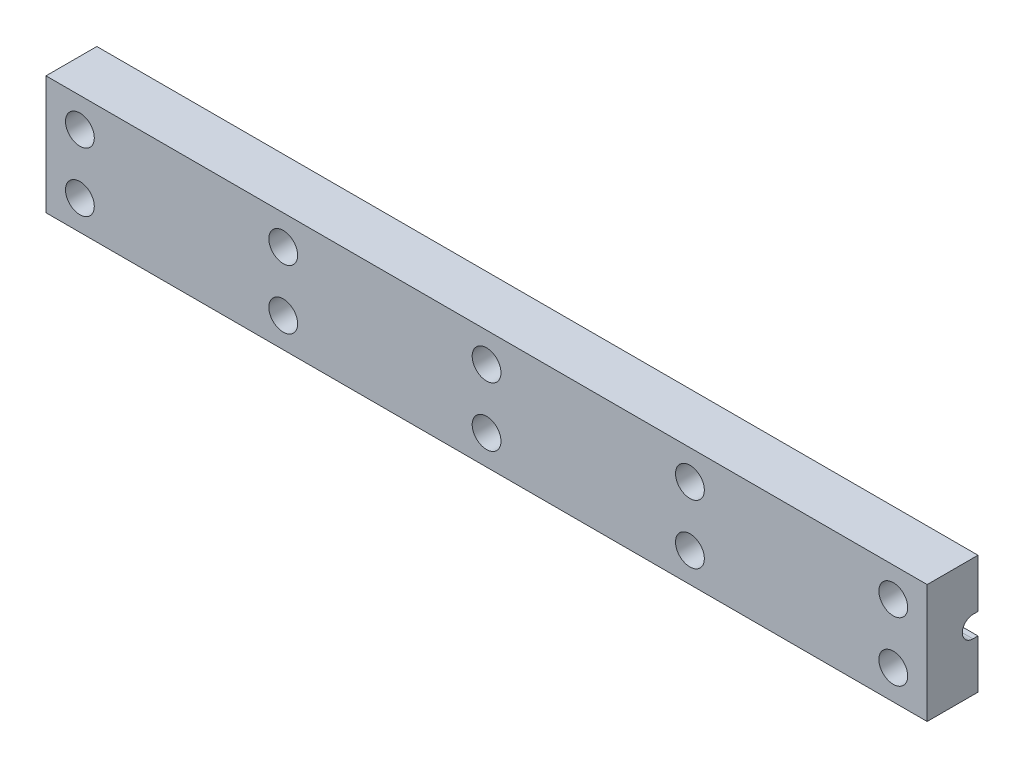
ISO-10303-21;
HEADER;
FILE_DESCRIPTION(('STEP AP214'),'2;1');
FILE_NAME('part.step','',(''),(''),'','','');
FILE_SCHEMA(('AUTOMOTIVE_DESIGN { 1 0 10303 214 1 1 1 1 }'));
ENDSEC;
DATA;
#1=APPLICATION_CONTEXT('core data for automotive mechanical design processes');
#2=APPLICATION_PROTOCOL_DEFINITION('international standard','automotive_design',2000,#1);
#3=PRODUCT_CONTEXT('',#1,'mechanical');
#4=PRODUCT('Part','Part','',(#3));
#5=PRODUCT_RELATED_PRODUCT_CATEGORY('part','',(#4));
#6=PRODUCT_DEFINITION_FORMATION('','',#4);
#7=PRODUCT_DEFINITION_CONTEXT('part definition',#1,'design');
#8=PRODUCT_DEFINITION('design','',#6,#7);
#9=PRODUCT_DEFINITION_SHAPE('','',#8);
#10=(LENGTH_UNIT() NAMED_UNIT(*) SI_UNIT(.MILLI.,.METRE.));
#11=(NAMED_UNIT(*) PLANE_ANGLE_UNIT() SI_UNIT($,.RADIAN.));
#12=(NAMED_UNIT(*) SI_UNIT($,.STERADIAN.) SOLID_ANGLE_UNIT());
#13=UNCERTAINTY_MEASURE_WITH_UNIT(LENGTH_MEASURE(1.E-05),#10,'distance_accuracy_value','');
#14=(GEOMETRIC_REPRESENTATION_CONTEXT(3) GLOBAL_UNCERTAINTY_ASSIGNED_CONTEXT((#13)) GLOBAL_UNIT_ASSIGNED_CONTEXT((#10,
#11,#12)) REPRESENTATION_CONTEXT('',''));
#15=CARTESIAN_POINT('',(0.,0.,0.));
#16=DIRECTION('',(0.,0.,1.));
#17=DIRECTION('',(1.,0.,0.));
#18=AXIS2_PLACEMENT_3D('',#15,#16,#17);
#19=CARTESIAN_POINT('',(170.645147999783,197.163538158501,246.970904960978));
#20=DIRECTION('',(0.,0.,1.));
#21=DIRECTION('',(1.,0.,0.));
#22=AXIS2_PLACEMENT_3D('',#19,#20,#21);
#23=PLANE('',#22);
#24=CARTESIAN_POINT('',(150.645147999783,204.663538158501,246.970904960979));
#25=DIRECTION('',(0.,0.,1.));
#26=DIRECTION('',(1.,0.,0.));
#27=AXIS2_PLACEMENT_3D('',#24,#25,#26);
#28=CIRCLE('',#27,1.70000000000001);
#29=CARTESIAN_POINT('',(152.345147999783,204.663538158501,246.970904960979));
#30=VERTEX_POINT('',#29);
#31=EDGE_CURVE('E127',#30,#30,#28,.T.);
#32=ORIENTED_EDGE('',*,*,#31,.F.);
#33=EDGE_LOOP('',(#32));
#34=FACE_BOUND('',#33,.T.);
#35=CARTESIAN_POINT('',(150.645147999783,197.6635381585,246.970904960979));
#36=DIRECTION('',(0.,0.,1.));
#37=DIRECTION('',(1.,0.,0.));
#38=AXIS2_PLACEMENT_3D('',#35,#36,#37);
#39=CIRCLE('',#38,1.70000000000001);
#40=CARTESIAN_POINT('',(152.345147999783,197.6635381585,246.970904960979));
#41=VERTEX_POINT('',#40);
#42=EDGE_CURVE('E219',#41,#41,#39,.T.);
#43=ORIENTED_EDGE('',*,*,#42,.F.);
#44=EDGE_LOOP('',(#43));
#45=FACE_BOUND('',#44,.T.);
#46=CARTESIAN_POINT('',(198.645147999783,204.663538158501,246.970904960979));
#47=DIRECTION('',(0.,0.,1.));
#48=DIRECTION('',(1.,0.,0.));
#49=AXIS2_PLACEMENT_3D('',#46,#47,#48);
#50=CIRCLE('',#49,1.70000000000001);
#51=CARTESIAN_POINT('',(200.345147999783,204.663538158501,246.970904960979));
#52=VERTEX_POINT('',#51);
#53=EDGE_CURVE('E156',#52,#52,#50,.F.);
#54=ORIENTED_EDGE('',*,*,#53,.T.);
#55=EDGE_LOOP('',(#54));
#56=FACE_BOUND('',#55,.T.);
#57=CARTESIAN_POINT('',(246.645147999783,204.663538158501,246.970904960979));
#58=DIRECTION('',(0.,0.,1.));
#59=DIRECTION('',(1.,0.,0.));
#60=AXIS2_PLACEMENT_3D('',#57,#58,#59);
#61=CIRCLE('',#60,1.70000000000001);
#62=CARTESIAN_POINT('',(248.345147999783,204.663538158501,246.970904960979));
#63=VERTEX_POINT('',#62);
#64=EDGE_CURVE('E146',#63,#63,#61,.F.);
#65=ORIENTED_EDGE('',*,*,#64,.T.);
#66=EDGE_LOOP('',(#65));
#67=FACE_BOUND('',#66,.T.);
#68=CARTESIAN_POINT('',(222.645147999783,197.663538158501,246.970904960979));
#69=DIRECTION('',(0.,0.,1.));
#70=DIRECTION('',(1.,0.,0.));
#71=AXIS2_PLACEMENT_3D('',#68,#69,#70);
#72=CIRCLE('',#71,1.70000000000001);
#73=CARTESIAN_POINT('',(224.345147999783,197.663538158501,246.970904960979));
#74=VERTEX_POINT('',#73);
#75=EDGE_CURVE('E147',#74,#74,#72,.T.);
#76=ORIENTED_EDGE('',*,*,#75,.F.);
#77=EDGE_LOOP('',(#76));
#78=FACE_BOUND('',#77,.T.);
#79=CARTESIAN_POINT('',(174.645147999783,197.6635381585,246.970904960979));
#80=DIRECTION('',(0.,0.,1.));
#81=DIRECTION('',(1.,0.,0.));
#82=AXIS2_PLACEMENT_3D('',#79,#80,#81);
#83=CIRCLE('',#82,1.70000000000001);
#84=CARTESIAN_POINT('',(176.345147999783,197.6635381585,246.970904960979));
#85=VERTEX_POINT('',#84);
#86=EDGE_CURVE('E162',#85,#85,#83,.T.);
#87=ORIENTED_EDGE('',*,*,#86,.F.);
#88=EDGE_LOOP('',(#87));
#89=FACE_BOUND('',#88,.T.);
#90=DIRECTION('',(1.,0.,0.));
#91=VECTOR('',#90,1.);
#92=CARTESIAN_POINT('',(170.645147999783,194.163538158501,246.970904960978));
#93=LINE('',#92,#91);
#94=CARTESIAN_POINT('',(146.645147999783,194.163538158501,246.970904960978));
#95=VERTEX_POINT('',#94);
#96=CARTESIAN_POINT('',(250.645147999783,194.163538158501,246.970904960978));
#97=VERTEX_POINT('',#96);
#98=EDGE_CURVE('E109',#95,#97,#93,.T.);
#99=ORIENTED_EDGE('',*,*,#98,.T.);
#100=DIRECTION('',(0.,-1.,0.));
#101=VECTOR('',#100,1.);
#102=CARTESIAN_POINT('',(250.645147999783,208.163538158501,246.970904960978));
#103=LINE('',#102,#101);
#104=CARTESIAN_POINT('',(250.645147999783,208.163538158501,246.970904960978));
#105=VERTEX_POINT('',#104);
#106=EDGE_CURVE('E105',#105,#97,#103,.T.);
#107=ORIENTED_EDGE('',*,*,#106,.F.);
#108=DIRECTION('',(1.,0.,0.));
#109=VECTOR('',#108,1.);
#110=CARTESIAN_POINT('',(170.645147999783,208.163538158501,246.970904960978));
#111=LINE('',#110,#109);
#112=CARTESIAN_POINT('',(146.645147999783,208.163538158501,246.970904960978));
#113=VERTEX_POINT('',#112);
#114=EDGE_CURVE('E99',#113,#105,#111,.T.);
#115=ORIENTED_EDGE('',*,*,#114,.F.);
#116=DIRECTION('',(0.,1.,0.));
#117=VECTOR('',#116,1.);
#118=CARTESIAN_POINT('',(146.645147999783,194.163538158501,246.970904960978));
#119=LINE('',#118,#117);
#120=EDGE_CURVE('E103',#95,#113,#119,.T.);
#121=ORIENTED_EDGE('',*,*,#120,.F.);
#122=EDGE_LOOP('',(#99,#107,#115,#121));
#123=FACE_BOUND('',#122,.T.);
#124=CARTESIAN_POINT('',(246.645147999783,197.663538158501,246.970904960979));
#125=DIRECTION('',(0.,0.,1.));
#126=DIRECTION('',(1.,0.,0.));
#127=AXIS2_PLACEMENT_3D('',#124,#125,#126);
#128=CIRCLE('',#127,1.70000000000001);
#129=CARTESIAN_POINT('',(248.345147999783,197.663538158501,246.970904960979));
#130=VERTEX_POINT('',#129);
#131=EDGE_CURVE('E143',#130,#130,#128,.T.);
#132=ORIENTED_EDGE('',*,*,#131,.F.);
#133=EDGE_LOOP('',(#132));
#134=FACE_BOUND('',#133,.T.);
#135=CARTESIAN_POINT('',(174.645147999783,204.663538158501,246.970904960979));
#136=DIRECTION('',(0.,0.,1.));
#137=DIRECTION('',(1.,0.,0.));
#138=AXIS2_PLACEMENT_3D('',#135,#136,#137);
#139=CIRCLE('',#138,1.70000000000001);
#140=CARTESIAN_POINT('',(176.345147999783,204.663538158501,246.970904960979));
#141=VERTEX_POINT('',#140);
#142=EDGE_CURVE('E159',#141,#141,#139,.F.);
#143=ORIENTED_EDGE('',*,*,#142,.T.);
#144=EDGE_LOOP('',(#143));
#145=FACE_BOUND('',#144,.T.);
#146=CARTESIAN_POINT('',(198.645147999783,197.663538158501,246.970904960979));
#147=DIRECTION('',(0.,0.,1.));
#148=DIRECTION('',(1.,0.,0.));
#149=AXIS2_PLACEMENT_3D('',#146,#147,#148);
#150=CIRCLE('',#149,1.70000000000001);
#151=CARTESIAN_POINT('',(200.345147999783,197.663538158501,246.970904960979));
#152=VERTEX_POINT('',#151);
#153=EDGE_CURVE('E153',#152,#152,#150,.T.);
#154=ORIENTED_EDGE('',*,*,#153,.F.);
#155=EDGE_LOOP('',(#154));
#156=FACE_BOUND('',#155,.T.);
#157=CARTESIAN_POINT('',(222.645147999783,204.663538158501,246.970904960979));
#158=DIRECTION('',(0.,0.,1.));
#159=DIRECTION('',(1.,0.,0.));
#160=AXIS2_PLACEMENT_3D('',#157,#158,#159);
#161=CIRCLE('',#160,1.70000000000001);
#162=CARTESIAN_POINT('',(224.345147999783,204.663538158501,246.970904960979));
#163=VERTEX_POINT('',#162);
#164=EDGE_CURVE('E150',#163,#163,#161,.F.);
#165=ORIENTED_EDGE('',*,*,#164,.T.);
#166=EDGE_LOOP('',(#165));
#167=FACE_BOUND('',#166,.T.);
#168=ADVANCED_FACE('F33',(#34,#45,#56,#67,#78,#89,#123,#134,#145,#156,#167),#23,.T.);
#169=CARTESIAN_POINT('',(170.645147999783,208.163538158501,240.970904960978));
#170=DIRECTION('',(0.,1.,0.));
#171=DIRECTION('',(0.,0.,1.));
#172=AXIS2_PLACEMENT_3D('',#169,#170,#171);
#173=PLANE('',#172);
#174=ORIENTED_EDGE('',*,*,#114,.T.);
#175=DIRECTION('',(0.,0.,1.));
#176=VECTOR('',#175,1.);
#177=CARTESIAN_POINT('',(250.645147999783,208.163538158501,240.970904960978));
#178=LINE('',#177,#176);
#179=CARTESIAN_POINT('',(250.645147999783,208.163538158501,240.970904960978));
#180=VERTEX_POINT('',#179);
#181=EDGE_CURVE('E191',#180,#105,#178,.T.);
#182=ORIENTED_EDGE('',*,*,#181,.F.);
#183=DIRECTION('',(1.,0.,0.));
#184=VECTOR('',#183,1.);
#185=CARTESIAN_POINT('',(170.645147999783,208.163538158501,240.970904960978));
#186=LINE('',#185,#184);
#187=CARTESIAN_POINT('',(146.645147999783,208.163538158501,240.970904960978));
#188=VERTEX_POINT('',#187);
#189=EDGE_CURVE('E11',#188,#180,#186,.T.);
#190=ORIENTED_EDGE('',*,*,#189,.F.);
#191=DIRECTION('',(0.,0.,-1.));
#192=VECTOR('',#191,1.);
#193=CARTESIAN_POINT('',(146.645147999783,208.163538158501,246.970904960978));
#194=LINE('',#193,#192);
#195=EDGE_CURVE('E113',#113,#188,#194,.T.);
#196=ORIENTED_EDGE('',*,*,#195,.F.);
#197=EDGE_LOOP('',(#174,#182,#190,#196));
#198=FACE_BOUND('',#197,.T.);
#199=ADVANCED_FACE('F35',(#198),#173,.T.);
#200=CARTESIAN_POINT('',(170.645147999783,205.163538158501,240.970904960978));
#201=DIRECTION('',(0.,0.,-1.));
#202=DIRECTION('',(-1.,0.,0.));
#203=AXIS2_PLACEMENT_3D('',#200,#201,#202);
#204=PLANE('',#203);
#205=CARTESIAN_POINT('',(150.645147999783,204.663538158501,240.970904960978));
#206=DIRECTION('',(0.,0.,-1.));
#207=DIRECTION('',(-1.,0.,0.));
#208=AXIS2_PLACEMENT_3D('',#205,#206,#207);
#209=CIRCLE('',#208,1.70000000000001);
#210=CARTESIAN_POINT('',(148.945147999783,204.663538158501,240.970904960978));
#211=VERTEX_POINT('',#210);
#212=EDGE_CURVE('E37',#211,#211,#209,.T.);
#213=ORIENTED_EDGE('',*,*,#212,.F.);
#214=EDGE_LOOP('',(#213));
#215=FACE_BOUND('',#214,.T.);
#216=CARTESIAN_POINT('',(222.645147999783,204.663538158501,240.970904960978));
#217=DIRECTION('',(0.,0.,-1.));
#218=DIRECTION('',(-1.,0.,0.));
#219=AXIS2_PLACEMENT_3D('',#216,#217,#218);
#220=CIRCLE('',#219,1.70000000000001);
#221=CARTESIAN_POINT('',(220.945147999783,204.663538158501,240.970904960978));
#222=VERTEX_POINT('',#221);
#223=EDGE_CURVE('E188',#222,#222,#220,.F.);
#224=ORIENTED_EDGE('',*,*,#223,.T.);
#225=EDGE_LOOP('',(#224));
#226=FACE_BOUND('',#225,.T.);
#227=CARTESIAN_POINT('',(198.645147999783,204.663538158501,240.970904960978));
#228=DIRECTION('',(0.,0.,-1.));
#229=DIRECTION('',(-1.,0.,0.));
#230=AXIS2_PLACEMENT_3D('',#227,#228,#229);
#231=CIRCLE('',#230,1.70000000000001);
#232=CARTESIAN_POINT('',(196.945147999783,204.663538158501,240.970904960978));
#233=VERTEX_POINT('',#232);
#234=EDGE_CURVE('E182',#233,#233,#231,.F.);
#235=ORIENTED_EDGE('',*,*,#234,.T.);
#236=EDGE_LOOP('',(#235));
#237=FACE_BOUND('',#236,.T.);
#238=CARTESIAN_POINT('',(174.645147999783,204.663538158501,240.970904960978));
#239=DIRECTION('',(0.,0.,-1.));
#240=DIRECTION('',(-1.,0.,0.));
#241=AXIS2_PLACEMENT_3D('',#238,#239,#240);
#242=CIRCLE('',#241,1.70000000000001);
#243=CARTESIAN_POINT('',(172.945147999783,204.663538158501,240.970904960978));
#244=VERTEX_POINT('',#243);
#245=EDGE_CURVE('E179',#244,#244,#242,.F.);
#246=ORIENTED_EDGE('',*,*,#245,.T.);
#247=EDGE_LOOP('',(#246));
#248=FACE_BOUND('',#247,.T.);
#249=CARTESIAN_POINT('',(246.645147999783,204.663538158501,240.970904960978));
#250=DIRECTION('',(0.,0.,-1.));
#251=DIRECTION('',(-1.,0.,0.));
#252=AXIS2_PLACEMENT_3D('',#249,#250,#251);
#253=CIRCLE('',#252,1.70000000000001);
#254=CARTESIAN_POINT('',(244.945147999783,204.663538158501,240.970904960978));
#255=VERTEX_POINT('',#254);
#256=EDGE_CURVE('E173',#255,#255,#253,.F.);
#257=ORIENTED_EDGE('',*,*,#256,.T.);
#258=EDGE_LOOP('',(#257));
#259=FACE_BOUND('',#258,.T.);
#260=ORIENTED_EDGE('',*,*,#189,.T.);
#261=DIRECTION('',(0.,1.,0.));
#262=VECTOR('',#261,1.);
#263=CARTESIAN_POINT('',(250.645147999783,202.413538158492,240.970904960978));
#264=LINE('',#263,#262);
#265=CARTESIAN_POINT('',(250.645147999783,202.413538158492,240.970904960978));
#266=VERTEX_POINT('',#265);
#267=EDGE_CURVE('E110',#266,#180,#264,.T.);
#268=ORIENTED_EDGE('',*,*,#267,.F.);
#269=DIRECTION('',(1.,0.,0.));
#270=VECTOR('',#269,1.);
#271=CARTESIAN_POINT('',(170.645147999783,202.413538158492,240.970904960978));
#272=LINE('',#271,#270);
#273=CARTESIAN_POINT('',(146.645147999783,202.413538158492,240.970904960978));
#274=VERTEX_POINT('',#273);
#275=EDGE_CURVE('E42',#274,#266,#272,.T.);
#276=ORIENTED_EDGE('',*,*,#275,.F.);
#277=DIRECTION('',(0.,-1.,0.));
#278=VECTOR('',#277,1.);
#279=CARTESIAN_POINT('',(146.645147999783,208.163538158501,240.970904960978));
#280=LINE('',#279,#278);
#281=EDGE_CURVE('E116',#188,#274,#280,.T.);
#282=ORIENTED_EDGE('',*,*,#281,.F.);
#283=EDGE_LOOP('',(#260,#268,#276,#282));
#284=FACE_BOUND('',#283,.T.);
#285=ADVANCED_FACE('F261',(#215,#226,#237,#248,#259,#284),#204,.T.);
#286=CARTESIAN_POINT('',(170.645147999783,202.413538158492,241.570904954906));
#287=DIRECTION('',(0.,-1.,0.));
#288=DIRECTION('',(0.,0.,-1.));
#289=AXIS2_PLACEMENT_3D('',#286,#287,#288);
#290=PLANE('',#289);
#291=ORIENTED_EDGE('',*,*,#275,.T.);
#292=DIRECTION('',(0.,0.,-1.));
#293=VECTOR('',#292,1.);
#294=CARTESIAN_POINT('',(250.645147999783,202.413538158492,241.570904954906));
#295=LINE('',#294,#293);
#296=CARTESIAN_POINT('',(250.645147999783,202.413538158492,241.570904954906));
#297=VERTEX_POINT('',#296);
#298=EDGE_CURVE('E206',#297,#266,#295,.T.);
#299=ORIENTED_EDGE('',*,*,#298,.F.);
#300=DIRECTION('',(1.,0.,0.));
#301=VECTOR('',#300,1.);
#302=CARTESIAN_POINT('',(170.645147999783,202.413538158492,241.570904954906));
#303=LINE('',#302,#301);
#304=CARTESIAN_POINT('',(146.645147999783,202.413538158492,241.570904954906));
#305=VERTEX_POINT('',#304);
#306=EDGE_CURVE('E210',#305,#297,#303,.T.);
#307=ORIENTED_EDGE('',*,*,#306,.F.);
#308=DIRECTION('',(0.,0.,1.));
#309=VECTOR('',#308,1.);
#310=CARTESIAN_POINT('',(146.645147999783,202.413538158492,240.970904960978));
#311=LINE('',#310,#309);
#312=EDGE_CURVE('E131',#274,#305,#311,.T.);
#313=ORIENTED_EDGE('',*,*,#312,.F.);
#314=EDGE_LOOP('',(#291,#299,#307,#313));
#315=FACE_BOUND('',#314,.T.);
#316=ADVANCED_FACE('F264',(#315),#290,.T.);
#317=CARTESIAN_POINT('',(170.645147999783,201.163538158492,241.570904960977));
#318=DIRECTION('',(1.,0.,0.));
#319=DIRECTION('',(0.,0.,-1.));
#320=AXIS2_PLACEMENT_3D('',#317,#318,#319);
#321=CYLINDRICAL_SURFACE('',#320,1.25);
#322=ORIENTED_EDGE('',*,*,#306,.T.);
#323=CARTESIAN_POINT('',(250.645147999783,201.163538158492,241.570904960977));
#324=DIRECTION('',(-1.,0.,0.));
#325=DIRECTION('',(0.,0.,-1.));
#326=AXIS2_PLACEMENT_3D('',#323,#324,#325);
#327=CIRCLE('',#326,1.25);
#328=CARTESIAN_POINT('',(250.645147999783,199.913538158492,241.570904960977));
#329=VERTEX_POINT('',#328);
#330=EDGE_CURVE('E203',#329,#297,#327,.T.);
#331=ORIENTED_EDGE('',*,*,#330,.F.);
#332=DIRECTION('',(1.,0.,0.));
#333=VECTOR('',#332,1.);
#334=CARTESIAN_POINT('',(170.645147999783,199.913538158492,241.570904960977));
#335=LINE('',#334,#333);
#336=CARTESIAN_POINT('',(146.645147999783,199.913538158492,241.570904960977));
#337=VERTEX_POINT('',#336);
#338=EDGE_CURVE('E212',#337,#329,#335,.T.);
#339=ORIENTED_EDGE('',*,*,#338,.F.);
#340=CARTESIAN_POINT('',(146.645147999783,201.163538158492,241.570904960977));
#341=DIRECTION('',(1.,0.,0.));
#342=DIRECTION('',(0.,0.,1.));
#343=AXIS2_PLACEMENT_3D('',#340,#341,#342);
#344=CIRCLE('',#343,1.25);
#345=EDGE_CURVE('E134',#305,#337,#344,.T.);
#346=ORIENTED_EDGE('',*,*,#345,.F.);
#347=EDGE_LOOP('',(#322,#331,#339,#346));
#348=FACE_BOUND('',#347,.T.);
#349=ADVANCED_FACE('F268',(#348),#321,.F.);
#350=CARTESIAN_POINT('',(170.645147999783,199.913538158492,240.970904960978));
#351=DIRECTION('',(0.,1.,0.));
#352=DIRECTION('',(0.,0.,1.));
#353=AXIS2_PLACEMENT_3D('',#350,#351,#352);
#354=PLANE('',#353);
#355=ORIENTED_EDGE('',*,*,#338,.T.);
#356=DIRECTION('',(0.,0.,1.));
#357=VECTOR('',#356,1.);
#358=CARTESIAN_POINT('',(250.645147999783,199.913538158492,240.970904960978));
#359=LINE('',#358,#357);
#360=CARTESIAN_POINT('',(250.645147999783,199.913538158492,240.970904960978));
#361=VERTEX_POINT('',#360);
#362=EDGE_CURVE('E200',#361,#329,#359,.T.);
#363=ORIENTED_EDGE('',*,*,#362,.F.);
#364=DIRECTION('',(1.,0.,0.));
#365=VECTOR('',#364,1.);
#366=CARTESIAN_POINT('',(170.645147999783,199.913538158492,240.970904960978));
#367=LINE('',#366,#365);
#368=CARTESIAN_POINT('',(146.645147999783,199.913538158492,240.970904960978));
#369=VERTEX_POINT('',#368);
#370=EDGE_CURVE('E214',#369,#361,#367,.T.);
#371=ORIENTED_EDGE('',*,*,#370,.F.);
#372=DIRECTION('',(0.,0.,-1.));
#373=VECTOR('',#372,1.);
#374=CARTESIAN_POINT('',(146.645147999783,199.913538158492,241.570904960977));
#375=LINE('',#374,#373);
#376=EDGE_CURVE('E137',#337,#369,#375,.T.);
#377=ORIENTED_EDGE('',*,*,#376,.F.);
#378=EDGE_LOOP('',(#355,#363,#371,#377));
#379=FACE_BOUND('',#378,.T.);
#380=ADVANCED_FACE('F271',(#379),#354,.T.);
#381=CARTESIAN_POINT('',(170.645147999783,197.163538158501,240.970904960978));
#382=DIRECTION('',(0.,0.,-1.));
#383=DIRECTION('',(-1.,0.,0.));
#384=AXIS2_PLACEMENT_3D('',#381,#382,#383);
#385=PLANE('',#384);
#386=CARTESIAN_POINT('',(150.645147999783,197.6635381585,240.970904960978));
#387=DIRECTION('',(0.,0.,-1.));
#388=DIRECTION('',(-1.,0.,0.));
#389=AXIS2_PLACEMENT_3D('',#386,#387,#388);
#390=CIRCLE('',#389,1.70000000000001);
#391=CARTESIAN_POINT('',(148.945147999783,197.6635381585,240.970904960978));
#392=VERTEX_POINT('',#391);
#393=EDGE_CURVE('E125',#392,#392,#390,.T.);
#394=ORIENTED_EDGE('',*,*,#393,.F.);
#395=EDGE_LOOP('',(#394));
#396=FACE_BOUND('',#395,.T.);
#397=CARTESIAN_POINT('',(198.645147999783,197.663538158501,240.970904960978));
#398=DIRECTION('',(0.,0.,-1.));
#399=DIRECTION('',(-1.,0.,0.));
#400=AXIS2_PLACEMENT_3D('',#397,#398,#399);
#401=CIRCLE('',#400,1.70000000000001);
#402=CARTESIAN_POINT('',(196.945147999783,197.663538158501,240.970904960978));
#403=VERTEX_POINT('',#402);
#404=EDGE_CURVE('E185',#403,#403,#401,.T.);
#405=ORIENTED_EDGE('',*,*,#404,.F.);
#406=EDGE_LOOP('',(#405));
#407=FACE_BOUND('',#406,.T.);
#408=CARTESIAN_POINT('',(246.645147999783,197.663538158501,240.970904960978));
#409=DIRECTION('',(0.,0.,-1.));
#410=DIRECTION('',(-1.,0.,0.));
#411=AXIS2_PLACEMENT_3D('',#408,#409,#410);
#412=CIRCLE('',#411,1.70000000000001);
#413=CARTESIAN_POINT('',(244.945147999783,197.663538158501,240.970904960978));
#414=VERTEX_POINT('',#413);
#415=EDGE_CURVE('E176',#414,#414,#412,.T.);
#416=ORIENTED_EDGE('',*,*,#415,.F.);
#417=EDGE_LOOP('',(#416));
#418=FACE_BOUND('',#417,.T.);
#419=CARTESIAN_POINT('',(222.645147999783,197.663538158501,240.970904960978));
#420=DIRECTION('',(0.,0.,-1.));
#421=DIRECTION('',(-1.,0.,0.));
#422=AXIS2_PLACEMENT_3D('',#419,#420,#421);
#423=CIRCLE('',#422,1.70000000000001);
#424=CARTESIAN_POINT('',(220.945147999783,197.663538158501,240.970904960978));
#425=VERTEX_POINT('',#424);
#426=EDGE_CURVE('E170',#425,#425,#423,.T.);
#427=ORIENTED_EDGE('',*,*,#426,.F.);
#428=EDGE_LOOP('',(#427));
#429=FACE_BOUND('',#428,.T.);
#430=CARTESIAN_POINT('',(174.645147999783,197.6635381585,240.970904960978));
#431=DIRECTION('',(0.,0.,-1.));
#432=DIRECTION('',(-1.,0.,0.));
#433=AXIS2_PLACEMENT_3D('',#430,#431,#432);
#434=CIRCLE('',#433,1.70000000000001);
#435=CARTESIAN_POINT('',(172.945147999783,197.6635381585,240.970904960978));
#436=VERTEX_POINT('',#435);
#437=EDGE_CURVE('E167',#436,#436,#434,.T.);
#438=ORIENTED_EDGE('',*,*,#437,.F.);
#439=EDGE_LOOP('',(#438));
#440=FACE_BOUND('',#439,.T.);
#441=ORIENTED_EDGE('',*,*,#370,.T.);
#442=DIRECTION('',(0.,1.,0.));
#443=VECTOR('',#442,1.);
#444=CARTESIAN_POINT('',(250.645147999783,194.163538158501,240.970904960978));
#445=LINE('',#444,#443);
#446=CARTESIAN_POINT('',(250.645147999783,194.163538158501,240.970904960978));
#447=VERTEX_POINT('',#446);
#448=EDGE_CURVE('E197',#447,#361,#445,.T.);
#449=ORIENTED_EDGE('',*,*,#448,.F.);
#450=DIRECTION('',(1.,0.,0.));
#451=VECTOR('',#450,1.);
#452=CARTESIAN_POINT('',(170.645147999783,194.163538158501,240.970904960978));
#453=LINE('',#452,#451);
#454=CARTESIAN_POINT('',(146.645147999783,194.163538158501,240.970904960978));
#455=VERTEX_POINT('',#454);
#456=EDGE_CURVE('E216',#455,#447,#453,.T.);
#457=ORIENTED_EDGE('',*,*,#456,.F.);
#458=DIRECTION('',(0.,-1.,0.));
#459=VECTOR('',#458,1.);
#460=CARTESIAN_POINT('',(146.645147999783,199.913538158492,240.970904960978));
#461=LINE('',#460,#459);
#462=EDGE_CURVE('E140',#369,#455,#461,.T.);
#463=ORIENTED_EDGE('',*,*,#462,.F.);
#464=EDGE_LOOP('',(#441,#449,#457,#463));
#465=FACE_BOUND('',#464,.T.);
#466=ADVANCED_FACE('F275',(#396,#407,#418,#429,#440,#465),#385,.T.);
#467=CARTESIAN_POINT('',(170.645147999783,194.163538158501,246.970904960978));
#468=DIRECTION('',(0.,-1.,0.));
#469=DIRECTION('',(0.,0.,-1.));
#470=AXIS2_PLACEMENT_3D('',#467,#468,#469);
#471=PLANE('',#470);
#472=ORIENTED_EDGE('',*,*,#456,.T.);
#473=DIRECTION('',(0.,0.,-1.));
#474=VECTOR('',#473,1.);
#475=CARTESIAN_POINT('',(250.645147999783,194.163538158501,246.970904960978));
#476=LINE('',#475,#474);
#477=EDGE_CURVE('E194',#97,#447,#476,.T.);
#478=ORIENTED_EDGE('',*,*,#477,.F.);
#479=ORIENTED_EDGE('',*,*,#98,.F.);
#480=DIRECTION('',(0.,0.,1.));
#481=VECTOR('',#480,1.);
#482=CARTESIAN_POINT('',(146.645147999783,194.163538158501,240.970904960978));
#483=LINE('',#482,#481);
#484=EDGE_CURVE('E122',#455,#95,#483,.T.);
#485=ORIENTED_EDGE('',*,*,#484,.F.);
#486=EDGE_LOOP('',(#472,#478,#479,#485));
#487=FACE_BOUND('',#486,.T.);
#488=ADVANCED_FACE('F254',(#487),#471,.T.);
#489=CARTESIAN_POINT('',(250.645147999783,201.163538158492,241.570904960977));
#490=DIRECTION('',(1.,0.,0.));
#491=DIRECTION('',(0.,0.,-1.));
#492=AXIS2_PLACEMENT_3D('',#489,#490,#491);
#493=PLANE('',#492);
#494=ORIENTED_EDGE('',*,*,#181,.T.);
#495=ORIENTED_EDGE('',*,*,#106,.T.);
#496=ORIENTED_EDGE('',*,*,#477,.T.);
#497=ORIENTED_EDGE('',*,*,#448,.T.);
#498=ORIENTED_EDGE('',*,*,#362,.T.);
#499=ORIENTED_EDGE('',*,*,#330,.T.);
#500=ORIENTED_EDGE('',*,*,#298,.T.);
#501=ORIENTED_EDGE('',*,*,#267,.T.);
#502=EDGE_LOOP('',(#494,#495,#496,#497,#498,#499,#500,#501));
#503=FACE_BOUND('',#502,.T.);
#504=ADVANCED_FACE('F244',(#503),#493,.T.);
#505=CARTESIAN_POINT('',(174.645147999783,197.6635381585,236.970904960979));
#506=DIRECTION('',(0.,0.,1.));
#507=DIRECTION('',(1.,0.,0.));
#508=AXIS2_PLACEMENT_3D('',#505,#506,#507);
#509=CYLINDRICAL_SURFACE('',#508,1.70000000000001);
#510=ORIENTED_EDGE('',*,*,#437,.T.);
#511=EDGE_LOOP('',(#510));
#512=FACE_BOUND('',#511,.T.);
#513=ORIENTED_EDGE('',*,*,#86,.T.);
#514=EDGE_LOOP('',(#513));
#515=FACE_BOUND('',#514,.T.);
#516=ADVANCED_FACE('F241',(#512,#515),#509,.F.);
#517=CARTESIAN_POINT('',(222.645147999783,197.663538158501,236.970904960979));
#518=DIRECTION('',(0.,0.,1.));
#519=DIRECTION('',(1.,0.,0.));
#520=AXIS2_PLACEMENT_3D('',#517,#518,#519);
#521=CYLINDRICAL_SURFACE('',#520,1.70000000000001);
#522=ORIENTED_EDGE('',*,*,#426,.T.);
#523=EDGE_LOOP('',(#522));
#524=FACE_BOUND('',#523,.T.);
#525=ORIENTED_EDGE('',*,*,#75,.T.);
#526=EDGE_LOOP('',(#525));
#527=FACE_BOUND('',#526,.T.);
#528=ADVANCED_FACE('F243',(#524,#527),#521,.F.);
#529=CARTESIAN_POINT('',(246.645147999783,204.663538158501,236.970904960979));
#530=DIRECTION('',(0.,0.,1.));
#531=DIRECTION('',(1.,0.,0.));
#532=AXIS2_PLACEMENT_3D('',#529,#530,#531);
#533=CYLINDRICAL_SURFACE('',#532,1.70000000000001);
#534=ORIENTED_EDGE('',*,*,#256,.F.);
#535=EDGE_LOOP('',(#534));
#536=FACE_BOUND('',#535,.T.);
#537=ORIENTED_EDGE('',*,*,#64,.F.);
#538=EDGE_LOOP('',(#537));
#539=FACE_BOUND('',#538,.T.);
#540=ADVANCED_FACE('F251',(#536,#539),#533,.F.);
#541=CARTESIAN_POINT('',(246.645147999783,197.663538158501,236.970904960979));
#542=DIRECTION('',(0.,0.,1.));
#543=DIRECTION('',(1.,0.,0.));
#544=AXIS2_PLACEMENT_3D('',#541,#542,#543);
#545=CYLINDRICAL_SURFACE('',#544,1.70000000000001);
#546=ORIENTED_EDGE('',*,*,#415,.T.);
#547=EDGE_LOOP('',(#546));
#548=FACE_BOUND('',#547,.T.);
#549=ORIENTED_EDGE('',*,*,#131,.T.);
#550=EDGE_LOOP('',(#549));
#551=FACE_BOUND('',#550,.T.);
#552=ADVANCED_FACE('F420',(#548,#551),#545,.F.);
#553=CARTESIAN_POINT('',(174.645147999783,204.663538158501,236.970904960979));
#554=DIRECTION('',(0.,0.,1.));
#555=DIRECTION('',(1.,0.,0.));
#556=AXIS2_PLACEMENT_3D('',#553,#554,#555);
#557=CYLINDRICAL_SURFACE('',#556,1.70000000000001);
#558=ORIENTED_EDGE('',*,*,#245,.F.);
#559=EDGE_LOOP('',(#558));
#560=FACE_BOUND('',#559,.T.);
#561=ORIENTED_EDGE('',*,*,#142,.F.);
#562=EDGE_LOOP('',(#561));
#563=FACE_BOUND('',#562,.T.);
#564=ADVANCED_FACE('F412',(#560,#563),#557,.F.);
#565=CARTESIAN_POINT('',(198.645147999783,204.663538158501,236.970904960979));
#566=DIRECTION('',(0.,0.,1.));
#567=DIRECTION('',(1.,0.,0.));
#568=AXIS2_PLACEMENT_3D('',#565,#566,#567);
#569=CYLINDRICAL_SURFACE('',#568,1.70000000000001);
#570=ORIENTED_EDGE('',*,*,#234,.F.);
#571=EDGE_LOOP('',(#570));
#572=FACE_BOUND('',#571,.T.);
#573=ORIENTED_EDGE('',*,*,#53,.F.);
#574=EDGE_LOOP('',(#573));
#575=FACE_BOUND('',#574,.T.);
#576=ADVANCED_FACE('F258',(#572,#575),#569,.F.);
#577=CARTESIAN_POINT('',(198.645147999783,197.663538158501,236.970904960979));
#578=DIRECTION('',(0.,0.,1.));
#579=DIRECTION('',(1.,0.,0.));
#580=AXIS2_PLACEMENT_3D('',#577,#578,#579);
#581=CYLINDRICAL_SURFACE('',#580,1.70000000000001);
#582=ORIENTED_EDGE('',*,*,#404,.T.);
#583=EDGE_LOOP('',(#582));
#584=FACE_BOUND('',#583,.T.);
#585=ORIENTED_EDGE('',*,*,#153,.T.);
#586=EDGE_LOOP('',(#585));
#587=FACE_BOUND('',#586,.T.);
#588=ADVANCED_FACE('F395',(#584,#587),#581,.F.);
#589=CARTESIAN_POINT('',(222.645147999783,204.663538158501,236.970904960979));
#590=DIRECTION('',(0.,0.,1.));
#591=DIRECTION('',(1.,0.,0.));
#592=AXIS2_PLACEMENT_3D('',#589,#590,#591);
#593=CYLINDRICAL_SURFACE('',#592,1.70000000000001);
#594=ORIENTED_EDGE('',*,*,#223,.F.);
#595=EDGE_LOOP('',(#594));
#596=FACE_BOUND('',#595,.T.);
#597=ORIENTED_EDGE('',*,*,#164,.F.);
#598=EDGE_LOOP('',(#597));
#599=FACE_BOUND('',#598,.T.);
#600=ADVANCED_FACE('F302',(#596,#599),#593,.F.);
#601=CARTESIAN_POINT('',(146.645147999783,201.163538158492,241.570904960977));
#602=DIRECTION('',(-1.,0.,0.));
#603=DIRECTION('',(0.,0.,1.));
#604=AXIS2_PLACEMENT_3D('',#601,#602,#603);
#605=PLANE('',#604);
#606=ORIENTED_EDGE('',*,*,#120,.T.);
#607=ORIENTED_EDGE('',*,*,#195,.T.);
#608=ORIENTED_EDGE('',*,*,#281,.T.);
#609=ORIENTED_EDGE('',*,*,#312,.T.);
#610=ORIENTED_EDGE('',*,*,#345,.T.);
#611=ORIENTED_EDGE('',*,*,#376,.T.);
#612=ORIENTED_EDGE('',*,*,#462,.T.);
#613=ORIENTED_EDGE('',*,*,#484,.T.);
#614=EDGE_LOOP('',(#606,#607,#608,#609,#610,#611,#612,#613));
#615=FACE_BOUND('',#614,.T.);
#616=ADVANCED_FACE('F119',(#615),#605,.T.);
#617=CARTESIAN_POINT('',(150.645147999783,197.6635381585,222.970904960979));
#618=DIRECTION('',(0.,0.,1.));
#619=DIRECTION('',(1.,0.,0.));
#620=AXIS2_PLACEMENT_3D('',#617,#618,#619);
#621=CYLINDRICAL_SURFACE('',#620,1.70000000000001);
#622=ORIENTED_EDGE('',*,*,#393,.T.);
#623=EDGE_LOOP('',(#622));
#624=FACE_BOUND('',#623,.T.);
#625=ORIENTED_EDGE('',*,*,#42,.T.);
#626=EDGE_LOOP('',(#625));
#627=FACE_BOUND('',#626,.T.);
#628=ADVANCED_FACE('F301',(#624,#627),#621,.F.);
#629=CARTESIAN_POINT('',(150.645147999783,204.663538158501,222.970904960979));
#630=DIRECTION('',(0.,0.,1.));
#631=DIRECTION('',(1.,0.,0.));
#632=AXIS2_PLACEMENT_3D('',#629,#630,#631);
#633=CYLINDRICAL_SURFACE('',#632,1.70000000000001);
#634=ORIENTED_EDGE('',*,*,#212,.T.);
#635=EDGE_LOOP('',(#634));
#636=FACE_BOUND('',#635,.T.);
#637=ORIENTED_EDGE('',*,*,#31,.T.);
#638=EDGE_LOOP('',(#637));
#639=FACE_BOUND('',#638,.T.);
#640=ADVANCED_FACE('F228',(#636,#639),#633,.F.);
#641=CLOSED_SHELL('',(#168,#199,#285,#316,#349,#380,#466,#488,#504,#516,#528,#540,#552,#564,
#576,#588,#600,#616,#628,#640));
#642=MANIFOLD_SOLID_BREP('B2',#641);
#643=ADVANCED_BREP_SHAPE_REPRESENTATION('',(#18,#642),#14);
#644=SHAPE_DEFINITION_REPRESENTATION(#9,#643);
ENDSEC;
END-ISO-10303-21;
